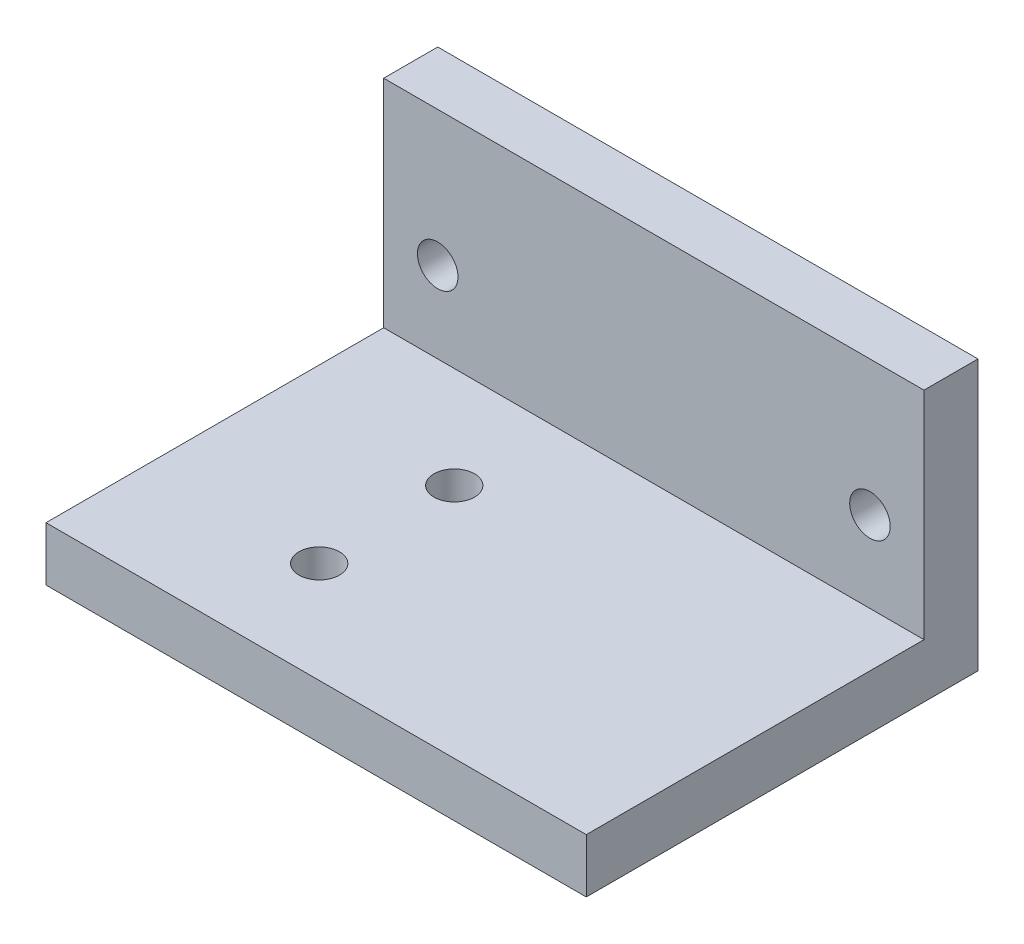
ISO-10303-21;
HEADER;
FILE_DESCRIPTION(('STEP AP214'),'2;1');
FILE_NAME('part.step','',(''),(''),'','','');
FILE_SCHEMA(('AUTOMOTIVE_DESIGN { 1 0 10303 214 1 1 1 1 }'));
ENDSEC;
DATA;
#1=APPLICATION_CONTEXT('core data for automotive mechanical design processes');
#2=APPLICATION_PROTOCOL_DEFINITION('international standard','automotive_design',2000,#1);
#3=PRODUCT_CONTEXT('',#1,'mechanical');
#4=PRODUCT('Part','Part','',(#3));
#5=PRODUCT_RELATED_PRODUCT_CATEGORY('part','',(#4));
#6=PRODUCT_DEFINITION_FORMATION('','',#4);
#7=PRODUCT_DEFINITION_CONTEXT('part definition',#1,'design');
#8=PRODUCT_DEFINITION('design','',#6,#7);
#9=PRODUCT_DEFINITION_SHAPE('','',#8);
#10=(LENGTH_UNIT() NAMED_UNIT(*) SI_UNIT(.MILLI.,.METRE.));
#11=(NAMED_UNIT(*) PLANE_ANGLE_UNIT() SI_UNIT($,.RADIAN.));
#12=(NAMED_UNIT(*) SI_UNIT($,.STERADIAN.) SOLID_ANGLE_UNIT());
#13=UNCERTAINTY_MEASURE_WITH_UNIT(LENGTH_MEASURE(1.E-05),#10,'distance_accuracy_value','');
#14=(GEOMETRIC_REPRESENTATION_CONTEXT(3) GLOBAL_UNCERTAINTY_ASSIGNED_CONTEXT((#13)) GLOBAL_UNIT_ASSIGNED_CONTEXT((#10,
#11,#12)) REPRESENTATION_CONTEXT('',''));
#15=CARTESIAN_POINT('',(0.,0.,0.));
#16=DIRECTION('',(0.,0.,1.));
#17=DIRECTION('',(1.,0.,0.));
#18=AXIS2_PLACEMENT_3D('',#15,#16,#17);
#19=CARTESIAN_POINT('',(0.,0.,4.));
#20=DIRECTION('',(0.,0.,-1.));
#21=DIRECTION('',(-1.,0.,0.));
#22=AXIS2_PLACEMENT_3D('',#19,#20,#21);
#23=PLANE('',#22);
#24=DIRECTION('',(0.,-1.,0.));
#25=VECTOR('',#24,1.);
#26=CARTESIAN_POINT('',(-20.,-10.,4.));
#27=LINE('',#26,#25);
#28=CARTESIAN_POINT('',(-20.,10.,4.));
#29=VERTEX_POINT('',#28);
#30=CARTESIAN_POINT('',(-20.,-6.,4.));
#31=VERTEX_POINT('',#30);
#32=EDGE_CURVE('E102',#29,#31,#27,.T.);
#33=ORIENTED_EDGE('',*,*,#32,.T.);
#34=DIRECTION('',(1.,0.,0.));
#35=VECTOR('',#34,1.);
#36=CARTESIAN_POINT('',(-20.,-6.,4.));
#37=LINE('',#36,#35);
#38=CARTESIAN_POINT('',(20.,-6.,4.));
#39=VERTEX_POINT('',#38);
#40=EDGE_CURVE('E148',#31,#39,#37,.T.);
#41=ORIENTED_EDGE('',*,*,#40,.T.);
#42=DIRECTION('',(0.,1.,0.));
#43=VECTOR('',#42,1.);
#44=CARTESIAN_POINT('',(20.,-10.,4.));
#45=LINE('',#44,#43);
#46=CARTESIAN_POINT('',(20.,10.,4.));
#47=VERTEX_POINT('',#46);
#48=EDGE_CURVE('E92',#39,#47,#45,.T.);
#49=ORIENTED_EDGE('',*,*,#48,.T.);
#50=DIRECTION('',(-1.,0.,0.));
#51=VECTOR('',#50,1.);
#52=CARTESIAN_POINT('',(-20.,10.,4.));
#53=LINE('',#52,#51);
#54=EDGE_CURVE('E59',#47,#29,#53,.T.);
#55=ORIENTED_EDGE('',*,*,#54,.T.);
#56=EDGE_LOOP('',(#33,#41,#49,#55));
#57=FACE_BOUND('',#56,.T.);
#58=CARTESIAN_POINT('',(-16.,0.,4.));
#59=DIRECTION('',(0.,0.,1.));
#60=DIRECTION('',(1.,0.,0.));
#61=AXIS2_PLACEMENT_3D('',#58,#59,#60);
#62=CIRCLE('',#61,1.5);
#63=CARTESIAN_POINT('',(-14.5,0.,4.));
#64=VERTEX_POINT('',#63);
#65=EDGE_CURVE('E107',#64,#64,#62,.T.);
#66=ORIENTED_EDGE('',*,*,#65,.F.);
#67=EDGE_LOOP('',(#66));
#68=FACE_BOUND('',#67,.T.);
#69=CARTESIAN_POINT('',(16.,0.,4.));
#70=DIRECTION('',(0.,0.,1.));
#71=DIRECTION('',(-1.,0.,0.));
#72=AXIS2_PLACEMENT_3D('',#69,#70,#71);
#73=CIRCLE('',#72,1.5);
#74=CARTESIAN_POINT('',(14.5,0.,4.));
#75=VERTEX_POINT('',#74);
#76=EDGE_CURVE('E129',#75,#75,#73,.T.);
#77=ORIENTED_EDGE('',*,*,#76,.F.);
#78=EDGE_LOOP('',(#77));
#79=FACE_BOUND('',#78,.T.);
#80=ADVANCED_FACE('F35',(#57,#68,#79),#23,.F.);
#81=CARTESIAN_POINT('',(0.,0.,0.));
#82=DIRECTION('',(0.,0.,-1.));
#83=DIRECTION('',(-1.,0.,0.));
#84=AXIS2_PLACEMENT_3D('',#81,#82,#83);
#85=PLANE('',#84);
#86=CARTESIAN_POINT('',(-16.,0.,0.));
#87=DIRECTION('',(0.,0.,1.));
#88=DIRECTION('',(1.,0.,0.));
#89=AXIS2_PLACEMENT_3D('',#86,#87,#88);
#90=CIRCLE('',#89,1.5);
#91=CARTESIAN_POINT('',(-14.5,0.,0.));
#92=VERTEX_POINT('',#91);
#93=EDGE_CURVE('E111',#92,#92,#90,.T.);
#94=ORIENTED_EDGE('',*,*,#93,.T.);
#95=EDGE_LOOP('',(#94));
#96=FACE_BOUND('',#95,.T.);
#97=DIRECTION('',(0.,1.,0.));
#98=VECTOR('',#97,1.);
#99=CARTESIAN_POINT('',(20.,-10.,0.));
#100=LINE('',#99,#98);
#101=CARTESIAN_POINT('',(20.,-10.,0.));
#102=VERTEX_POINT('',#101);
#103=CARTESIAN_POINT('',(20.,10.,0.));
#104=VERTEX_POINT('',#103);
#105=EDGE_CURVE('E98',#102,#104,#100,.T.);
#106=ORIENTED_EDGE('',*,*,#105,.F.);
#107=DIRECTION('',(1.,0.,0.));
#108=VECTOR('',#107,1.);
#109=CARTESIAN_POINT('',(-20.,-10.,0.));
#110=LINE('',#109,#108);
#111=CARTESIAN_POINT('',(-20.,-10.,0.));
#112=VERTEX_POINT('',#111);
#113=EDGE_CURVE('E79',#112,#102,#110,.T.);
#114=ORIENTED_EDGE('',*,*,#113,.F.);
#115=DIRECTION('',(0.,-1.,0.));
#116=VECTOR('',#115,1.);
#117=CARTESIAN_POINT('',(-20.,-10.,0.));
#118=LINE('',#117,#116);
#119=CARTESIAN_POINT('',(-20.,10.,0.));
#120=VERTEX_POINT('',#119);
#121=EDGE_CURVE('E93',#120,#112,#118,.T.);
#122=ORIENTED_EDGE('',*,*,#121,.F.);
#123=DIRECTION('',(-1.,0.,0.));
#124=VECTOR('',#123,1.);
#125=CARTESIAN_POINT('',(-20.,10.,0.));
#126=LINE('',#125,#124);
#127=EDGE_CURVE('E106',#104,#120,#126,.T.);
#128=ORIENTED_EDGE('',*,*,#127,.F.);
#129=EDGE_LOOP('',(#106,#114,#122,#128));
#130=FACE_BOUND('',#129,.T.);
#131=CARTESIAN_POINT('',(16.,0.,0.));
#132=DIRECTION('',(0.,0.,1.));
#133=DIRECTION('',(-1.,0.,0.));
#134=AXIS2_PLACEMENT_3D('',#131,#132,#133);
#135=CIRCLE('',#134,1.5);
#136=CARTESIAN_POINT('',(14.5,0.,0.));
#137=VERTEX_POINT('',#136);
#138=EDGE_CURVE('E131',#137,#137,#135,.T.);
#139=ORIENTED_EDGE('',*,*,#138,.T.);
#140=EDGE_LOOP('',(#139));
#141=FACE_BOUND('',#140,.T.);
#142=ADVANCED_FACE('F104',(#96,#130,#141),#85,.T.);
#143=CARTESIAN_POINT('',(20.,-10.,4.));
#144=DIRECTION('',(-1.,0.,0.));
#145=DIRECTION('',(0.,0.,1.));
#146=AXIS2_PLACEMENT_3D('',#143,#144,#145);
#147=PLANE('',#146);
#148=ORIENTED_EDGE('',*,*,#105,.T.);
#149=DIRECTION('',(0.,0.,-1.));
#150=VECTOR('',#149,1.);
#151=CARTESIAN_POINT('',(20.,10.,4.));
#152=LINE('',#151,#150);
#153=EDGE_CURVE('E11',#47,#104,#152,.T.);
#154=ORIENTED_EDGE('',*,*,#153,.F.);
#155=ORIENTED_EDGE('',*,*,#48,.F.);
#156=DIRECTION('',(0.,0.,1.));
#157=VECTOR('',#156,1.);
#158=CARTESIAN_POINT('',(20.,-6.,4.));
#159=LINE('',#158,#157);
#160=CARTESIAN_POINT('',(20.,-6.,29.));
#161=VERTEX_POINT('',#160);
#162=EDGE_CURVE('E50',#39,#161,#159,.T.);
#163=ORIENTED_EDGE('',*,*,#162,.T.);
#164=DIRECTION('',(0.,-1.,0.));
#165=VECTOR('',#164,1.);
#166=CARTESIAN_POINT('',(20.,-6.,29.));
#167=LINE('',#166,#165);
#168=CARTESIAN_POINT('',(20.,-10.,29.));
#169=VERTEX_POINT('',#168);
#170=EDGE_CURVE('E100',#161,#169,#167,.T.);
#171=ORIENTED_EDGE('',*,*,#170,.T.);
#172=DIRECTION('',(0.,0.,-1.));
#173=VECTOR('',#172,1.);
#174=CARTESIAN_POINT('',(20.,-10.,4.));
#175=LINE('',#174,#173);
#176=EDGE_CURVE('E85',#169,#102,#175,.T.);
#177=ORIENTED_EDGE('',*,*,#176,.T.);
#178=EDGE_LOOP('',(#148,#154,#155,#163,#171,#177));
#179=FACE_BOUND('',#178,.T.);
#180=ADVANCED_FACE('F37',(#179),#147,.F.);
#181=CARTESIAN_POINT('',(-20.,10.,4.));
#182=DIRECTION('',(0.,-1.,0.));
#183=DIRECTION('',(0.,0.,-1.));
#184=AXIS2_PLACEMENT_3D('',#181,#182,#183);
#185=PLANE('',#184);
#186=ORIENTED_EDGE('',*,*,#127,.T.);
#187=DIRECTION('',(0.,0.,-1.));
#188=VECTOR('',#187,1.);
#189=CARTESIAN_POINT('',(-20.,10.,4.));
#190=LINE('',#189,#188);
#191=EDGE_CURVE('E43',#29,#120,#190,.T.);
#192=ORIENTED_EDGE('',*,*,#191,.F.);
#193=ORIENTED_EDGE('',*,*,#54,.F.);
#194=ORIENTED_EDGE('',*,*,#153,.T.);
#195=EDGE_LOOP('',(#186,#192,#193,#194));
#196=FACE_BOUND('',#195,.T.);
#197=ADVANCED_FACE('F123',(#196),#185,.F.);
#198=CARTESIAN_POINT('',(-20.,-10.,4.));
#199=DIRECTION('',(1.,0.,0.));
#200=DIRECTION('',(0.,0.,-1.));
#201=AXIS2_PLACEMENT_3D('',#198,#199,#200);
#202=PLANE('',#201);
#203=ORIENTED_EDGE('',*,*,#121,.T.);
#204=DIRECTION('',(0.,0.,-1.));
#205=VECTOR('',#204,1.);
#206=CARTESIAN_POINT('',(-20.,-10.,4.));
#207=LINE('',#206,#205);
#208=CARTESIAN_POINT('',(-20.,-10.,29.));
#209=VERTEX_POINT('',#208);
#210=EDGE_CURVE('E88',#209,#112,#207,.T.);
#211=ORIENTED_EDGE('',*,*,#210,.F.);
#212=DIRECTION('',(0.,-1.,0.));
#213=VECTOR('',#212,1.);
#214=CARTESIAN_POINT('',(-20.,-6.,29.));
#215=LINE('',#214,#213);
#216=CARTESIAN_POINT('',(-20.,-6.,29.));
#217=VERTEX_POINT('',#216);
#218=EDGE_CURVE('E134',#217,#209,#215,.T.);
#219=ORIENTED_EDGE('',*,*,#218,.F.);
#220=DIRECTION('',(0.,0.,-1.));
#221=VECTOR('',#220,1.);
#222=CARTESIAN_POINT('',(-20.,-6.,4.));
#223=LINE('',#222,#221);
#224=EDGE_CURVE('E143',#217,#31,#223,.T.);
#225=ORIENTED_EDGE('',*,*,#224,.T.);
#226=ORIENTED_EDGE('',*,*,#32,.F.);
#227=ORIENTED_EDGE('',*,*,#191,.T.);
#228=EDGE_LOOP('',(#203,#211,#219,#225,#226,#227));
#229=FACE_BOUND('',#228,.T.);
#230=ADVANCED_FACE('F120',(#229),#202,.F.);
#231=CARTESIAN_POINT('',(-20.,-10.,4.));
#232=DIRECTION('',(0.,1.,0.));
#233=DIRECTION('',(0.,0.,1.));
#234=AXIS2_PLACEMENT_3D('',#231,#232,#233);
#235=PLANE('',#234);
#236=ORIENTED_EDGE('',*,*,#113,.T.);
#237=ORIENTED_EDGE('',*,*,#176,.F.);
#238=DIRECTION('',(-1.,0.,0.));
#239=VECTOR('',#238,1.);
#240=CARTESIAN_POINT('',(-20.,-10.,29.));
#241=LINE('',#240,#239);
#242=EDGE_CURVE('E141',#169,#209,#241,.T.);
#243=ORIENTED_EDGE('',*,*,#242,.T.);
#244=ORIENTED_EDGE('',*,*,#210,.T.);
#245=EDGE_LOOP('',(#236,#237,#243,#244));
#246=FACE_BOUND('',#245,.T.);
#247=CARTESIAN_POINT('',(-7.27406928000818,-10.,21.5));
#248=DIRECTION('',(0.,-1.,0.));
#249=DIRECTION('',(0.,0.,-1.));
#250=AXIS2_PLACEMENT_3D('',#247,#248,#249);
#251=CIRCLE('',#250,1.5);
#252=CARTESIAN_POINT('',(-7.27406928000818,-10.,20.));
#253=VERTEX_POINT('',#252);
#254=EDGE_CURVE('E157',#253,#253,#251,.T.);
#255=ORIENTED_EDGE('',*,*,#254,.F.);
#256=EDGE_LOOP('',(#255));
#257=FACE_BOUND('',#256,.T.);
#258=CARTESIAN_POINT('',(-7.27406928000818,-10.,11.5));
#259=DIRECTION('',(0.,-1.,0.));
#260=DIRECTION('',(0.,0.,-1.));
#261=AXIS2_PLACEMENT_3D('',#258,#259,#260);
#262=CIRCLE('',#261,1.5);
#263=CARTESIAN_POINT('',(-7.27406928000818,-10.,10.));
#264=VERTEX_POINT('',#263);
#265=EDGE_CURVE('E151',#264,#264,#262,.T.);
#266=ORIENTED_EDGE('',*,*,#265,.F.);
#267=EDGE_LOOP('',(#266));
#268=FACE_BOUND('',#267,.T.);
#269=ADVANCED_FACE('F81',(#246,#257,#268),#235,.F.);
#270=CARTESIAN_POINT('',(-16.,0.,4.));
#271=DIRECTION('',(0.,0.,-1.));
#272=DIRECTION('',(-1.,0.,0.));
#273=AXIS2_PLACEMENT_3D('',#270,#271,#272);
#274=CYLINDRICAL_SURFACE('',#273,1.5);
#275=ORIENTED_EDGE('',*,*,#65,.T.);
#276=EDGE_LOOP('',(#275));
#277=FACE_BOUND('',#276,.T.);
#278=ORIENTED_EDGE('',*,*,#93,.F.);
#279=EDGE_LOOP('',(#278));
#280=FACE_BOUND('',#279,.T.);
#281=ADVANCED_FACE('F174',(#277,#280),#274,.F.);
#282=CARTESIAN_POINT('',(16.,0.,4.));
#283=DIRECTION('',(0.,0.,-1.));
#284=DIRECTION('',(-1.,0.,0.));
#285=AXIS2_PLACEMENT_3D('',#282,#283,#284);
#286=CYLINDRICAL_SURFACE('',#285,1.5);
#287=ORIENTED_EDGE('',*,*,#76,.T.);
#288=EDGE_LOOP('',(#287));
#289=FACE_BOUND('',#288,.T.);
#290=ORIENTED_EDGE('',*,*,#138,.F.);
#291=EDGE_LOOP('',(#290));
#292=FACE_BOUND('',#291,.T.);
#293=ADVANCED_FACE('F226',(#289,#292),#286,.F.);
#294=CARTESIAN_POINT('',(-20.,-6.,29.));
#295=DIRECTION('',(0.,0.,1.));
#296=DIRECTION('',(1.,0.,0.));
#297=AXIS2_PLACEMENT_3D('',#294,#295,#296);
#298=PLANE('',#297);
#299=ORIENTED_EDGE('',*,*,#242,.F.);
#300=ORIENTED_EDGE('',*,*,#170,.F.);
#301=DIRECTION('',(-1.,0.,0.));
#302=VECTOR('',#301,1.);
#303=CARTESIAN_POINT('',(-20.,-6.,29.));
#304=LINE('',#303,#302);
#305=EDGE_CURVE('E138',#161,#217,#304,.T.);
#306=ORIENTED_EDGE('',*,*,#305,.T.);
#307=ORIENTED_EDGE('',*,*,#218,.T.);
#308=EDGE_LOOP('',(#299,#300,#306,#307));
#309=FACE_BOUND('',#308,.T.);
#310=ADVANCED_FACE('F184',(#309),#298,.T.);
#311=CARTESIAN_POINT('',(0.,-6.,0.));
#312=DIRECTION('',(0.,1.,0.));
#313=DIRECTION('',(0.,0.,1.));
#314=AXIS2_PLACEMENT_3D('',#311,#312,#313);
#315=PLANE('',#314);
#316=CARTESIAN_POINT('',(-7.27406928000818,-6.,21.5));
#317=DIRECTION('',(0.,-1.,0.));
#318=DIRECTION('',(0.,0.,-1.));
#319=AXIS2_PLACEMENT_3D('',#316,#317,#318);
#320=CIRCLE('',#319,1.5);
#321=CARTESIAN_POINT('',(-7.27406928000818,-6.,20.));
#322=VERTEX_POINT('',#321);
#323=EDGE_CURVE('E154',#322,#322,#320,.T.);
#324=ORIENTED_EDGE('',*,*,#323,.T.);
#325=EDGE_LOOP('',(#324));
#326=FACE_BOUND('',#325,.T.);
#327=CARTESIAN_POINT('',(-7.27406928000818,-6.,11.5));
#328=DIRECTION('',(0.,-1.,0.));
#329=DIRECTION('',(0.,0.,-1.));
#330=AXIS2_PLACEMENT_3D('',#327,#328,#329);
#331=CIRCLE('',#330,1.5);
#332=CARTESIAN_POINT('',(-7.27406928000818,-6.,10.));
#333=VERTEX_POINT('',#332);
#334=EDGE_CURVE('E144',#333,#333,#331,.T.);
#335=ORIENTED_EDGE('',*,*,#334,.T.);
#336=EDGE_LOOP('',(#335));
#337=FACE_BOUND('',#336,.T.);
#338=ORIENTED_EDGE('',*,*,#224,.F.);
#339=ORIENTED_EDGE('',*,*,#305,.F.);
#340=ORIENTED_EDGE('',*,*,#162,.F.);
#341=ORIENTED_EDGE('',*,*,#40,.F.);
#342=EDGE_LOOP('',(#338,#339,#340,#341));
#343=FACE_BOUND('',#342,.T.);
#344=ADVANCED_FACE('F163',(#326,#337,#343),#315,.T.);
#345=CARTESIAN_POINT('',(-7.27406928000818,-6.,11.5));
#346=DIRECTION('',(0.,-1.,0.));
#347=DIRECTION('',(0.,0.,-1.));
#348=AXIS2_PLACEMENT_3D('',#345,#346,#347);
#349=CYLINDRICAL_SURFACE('',#348,1.5);
#350=ORIENTED_EDGE('',*,*,#334,.F.);
#351=EDGE_LOOP('',(#350));
#352=FACE_BOUND('',#351,.T.);
#353=ORIENTED_EDGE('',*,*,#265,.T.);
#354=EDGE_LOOP('',(#353));
#355=FACE_BOUND('',#354,.T.);
#356=ADVANCED_FACE('F169',(#352,#355),#349,.F.);
#357=CARTESIAN_POINT('',(-7.27406928000818,-6.,21.5));
#358=DIRECTION('',(0.,-1.,0.));
#359=DIRECTION('',(0.,0.,-1.));
#360=AXIS2_PLACEMENT_3D('',#357,#358,#359);
#361=CYLINDRICAL_SURFACE('',#360,1.5);
#362=ORIENTED_EDGE('',*,*,#323,.F.);
#363=EDGE_LOOP('',(#362));
#364=FACE_BOUND('',#363,.T.);
#365=ORIENTED_EDGE('',*,*,#254,.T.);
#366=EDGE_LOOP('',(#365));
#367=FACE_BOUND('',#366,.T.);
#368=ADVANCED_FACE('F166',(#364,#367),#361,.F.);
#369=CLOSED_SHELL('',(#80,#142,#180,#197,#230,#269,#281,#293,#310,#344,#356,#368));
#370=MANIFOLD_SOLID_BREP('B2',#369);
#371=ADVANCED_BREP_SHAPE_REPRESENTATION('',(#18,#370),#14);
#372=SHAPE_DEFINITION_REPRESENTATION(#9,#371);
ENDSEC;
END-ISO-10303-21;
